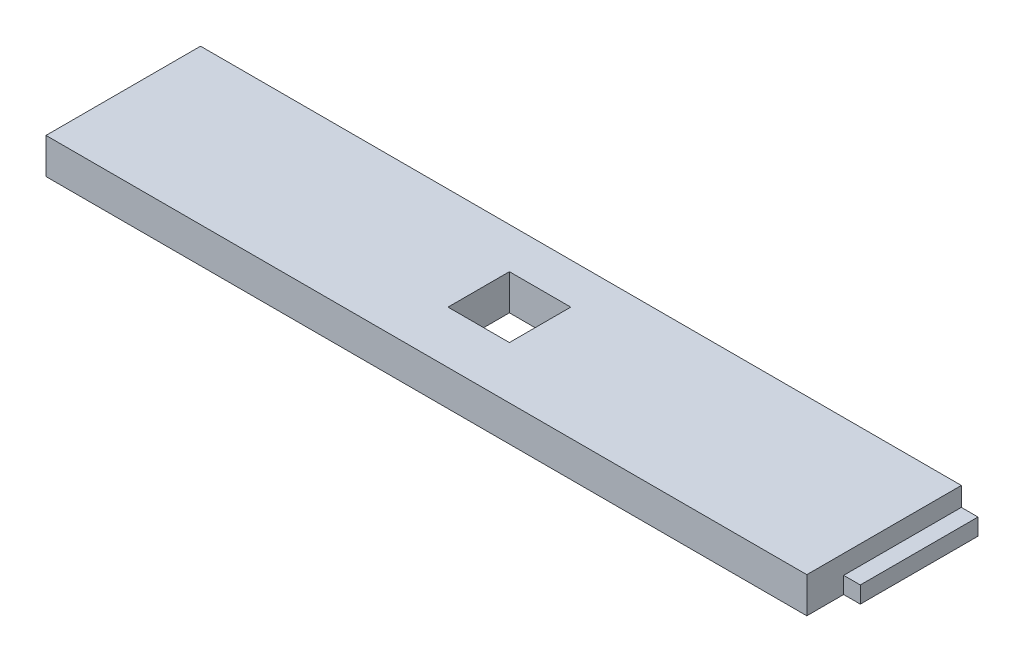
ISO-10303-21;
HEADER;
FILE_DESCRIPTION(('STEP AP214'),'2;1');
FILE_NAME('part.step','',(''),(''),'','','');
FILE_SCHEMA(('AUTOMOTIVE_DESIGN { 1 0 10303 214 1 1 1 1 }'));
ENDSEC;
DATA;
#1=APPLICATION_CONTEXT('core data for automotive mechanical design processes');
#2=APPLICATION_PROTOCOL_DEFINITION('international standard','automotive_design',2000,#1);
#3=PRODUCT_CONTEXT('',#1,'mechanical');
#4=PRODUCT('Part','Part','',(#3));
#5=PRODUCT_RELATED_PRODUCT_CATEGORY('part','',(#4));
#6=PRODUCT_DEFINITION_FORMATION('','',#4);
#7=PRODUCT_DEFINITION_CONTEXT('part definition',#1,'design');
#8=PRODUCT_DEFINITION('design','',#6,#7);
#9=PRODUCT_DEFINITION_SHAPE('','',#8);
#10=(LENGTH_UNIT() NAMED_UNIT(*) SI_UNIT(.MILLI.,.METRE.));
#11=(NAMED_UNIT(*) PLANE_ANGLE_UNIT() SI_UNIT($,.RADIAN.));
#12=(NAMED_UNIT(*) SI_UNIT($,.STERADIAN.) SOLID_ANGLE_UNIT());
#13=UNCERTAINTY_MEASURE_WITH_UNIT(LENGTH_MEASURE(1.E-05),#10,'distance_accuracy_value','');
#14=(GEOMETRIC_REPRESENTATION_CONTEXT(3) GLOBAL_UNCERTAINTY_ASSIGNED_CONTEXT((#13)) GLOBAL_UNIT_ASSIGNED_CONTEXT((#10,
#11,#12)) REPRESENTATION_CONTEXT('',''));
#15=CARTESIAN_POINT('',(0.,0.,0.));
#16=DIRECTION('',(0.,0.,1.));
#17=DIRECTION('',(1.,0.,0.));
#18=AXIS2_PLACEMENT_3D('',#15,#16,#17);
#19=CARTESIAN_POINT('',(25.815,30.,0.));
#20=DIRECTION('',(-1.,0.,0.));
#21=DIRECTION('',(0.,0.,1.));
#22=AXIS2_PLACEMENT_3D('',#19,#20,#21);
#23=PLANE('',#22);
#24=DIRECTION('',(0.,0.,-1.));
#25=VECTOR('',#24,1.);
#26=CARTESIAN_POINT('',(25.815,0.,0.));
#27=LINE('',#26,#25);
#28=CARTESIAN_POINT('',(25.815,0.,21.));
#29=VERTEX_POINT('',#28);
#30=CARTESIAN_POINT('',(25.815,0.,-30.63));
#31=VERTEX_POINT('',#30);
#32=EDGE_CURVE('E222',#29,#31,#27,.T.);
#33=ORIENTED_EDGE('',*,*,#32,.F.);
#34=DIRECTION('',(0.,-1.,0.));
#35=VECTOR('',#34,1.);
#36=CARTESIAN_POINT('',(25.815,30.,21.));
#37=LINE('',#36,#35);
#38=CARTESIAN_POINT('',(25.815,30.,21.));
#39=VERTEX_POINT('',#38);
#40=EDGE_CURVE('E11',#39,#29,#37,.T.);
#41=ORIENTED_EDGE('',*,*,#40,.F.);
#42=DIRECTION('',(0.,0.,-1.));
#43=VECTOR('',#42,1.);
#44=CARTESIAN_POINT('',(25.815,30.,0.));
#45=LINE('',#44,#43);
#46=CARTESIAN_POINT('',(25.815,30.,-30.63));
#47=VERTEX_POINT('',#46);
#48=EDGE_CURVE('E202',#39,#47,#45,.T.);
#49=ORIENTED_EDGE('',*,*,#48,.T.);
#50=DIRECTION('',(0.,-1.,0.));
#51=VECTOR('',#50,1.);
#52=CARTESIAN_POINT('',(25.815,30.,-30.63));
#53=LINE('',#52,#51);
#54=EDGE_CURVE('E233',#47,#31,#53,.T.);
#55=ORIENTED_EDGE('',*,*,#54,.T.);
#56=EDGE_LOOP('',(#33,#41,#49,#55));
#57=FACE_BOUND('',#56,.T.);
#58=ADVANCED_FACE('F35',(#57),#23,.T.);
#59=CARTESIAN_POINT('',(0.,30.,21.));
#60=DIRECTION('',(0.,0.,-1.));
#61=DIRECTION('',(-1.,0.,0.));
#62=AXIS2_PLACEMENT_3D('',#59,#60,#61);
#63=PLANE('',#62);
#64=DIRECTION('',(1.,0.,0.));
#65=VECTOR('',#64,1.);
#66=CARTESIAN_POINT('',(0.,0.,21.));
#67=LINE('',#66,#65);
#68=CARTESIAN_POINT('',(-25.815,0.,21.));
#69=VERTEX_POINT('',#68);
#70=EDGE_CURVE('E225',#69,#29,#67,.T.);
#71=ORIENTED_EDGE('',*,*,#70,.F.);
#72=DIRECTION('',(0.,-1.,0.));
#73=VECTOR('',#72,1.);
#74=CARTESIAN_POINT('',(-25.815,30.,21.));
#75=LINE('',#74,#73);
#76=CARTESIAN_POINT('',(-25.815,30.,21.));
#77=VERTEX_POINT('',#76);
#78=EDGE_CURVE('E44',#77,#69,#75,.T.);
#79=ORIENTED_EDGE('',*,*,#78,.F.);
#80=DIRECTION('',(1.,0.,0.));
#81=VECTOR('',#80,1.);
#82=CARTESIAN_POINT('',(0.,30.,21.));
#83=LINE('',#82,#81);
#84=EDGE_CURVE('E205',#77,#39,#83,.T.);
#85=ORIENTED_EDGE('',*,*,#84,.T.);
#86=ORIENTED_EDGE('',*,*,#40,.T.);
#87=EDGE_LOOP('',(#71,#79,#85,#86));
#88=FACE_BOUND('',#87,.T.);
#89=ADVANCED_FACE('F279',(#88),#63,.T.);
#90=CARTESIAN_POINT('',(-25.815,30.,0.));
#91=DIRECTION('',(-1.,0.,0.));
#92=DIRECTION('',(0.,0.,1.));
#93=AXIS2_PLACEMENT_3D('',#90,#91,#92);
#94=PLANE('',#93);
#95=DIRECTION('',(0.,0.,-1.));
#96=VECTOR('',#95,1.);
#97=CARTESIAN_POINT('',(-25.815,0.,0.));
#98=LINE('',#97,#96);
#99=CARTESIAN_POINT('',(-25.815,0.,-30.63));
#100=VERTEX_POINT('',#99);
#101=EDGE_CURVE('E228',#69,#100,#98,.T.);
#102=ORIENTED_EDGE('',*,*,#101,.T.);
#103=DIRECTION('',(0.,-1.,0.));
#104=VECTOR('',#103,1.);
#105=CARTESIAN_POINT('',(-25.815,30.,-30.63));
#106=LINE('',#105,#104);
#107=CARTESIAN_POINT('',(-25.815,30.,-30.63));
#108=VERTEX_POINT('',#107);
#109=EDGE_CURVE('E235',#108,#100,#106,.T.);
#110=ORIENTED_EDGE('',*,*,#109,.F.);
#111=DIRECTION('',(0.,0.,-1.));
#112=VECTOR('',#111,1.);
#113=CARTESIAN_POINT('',(-25.815,30.,0.));
#114=LINE('',#113,#112);
#115=EDGE_CURVE('E208',#77,#108,#114,.T.);
#116=ORIENTED_EDGE('',*,*,#115,.F.);
#117=ORIENTED_EDGE('',*,*,#78,.T.);
#118=EDGE_LOOP('',(#102,#110,#116,#117));
#119=FACE_BOUND('',#118,.T.);
#120=ADVANCED_FACE('F274',(#119),#94,.F.);
#121=CARTESIAN_POINT('',(320.,30.,0.));
#122=DIRECTION('',(1.,0.,0.));
#123=DIRECTION('',(0.,0.,-1.));
#124=AXIS2_PLACEMENT_3D('',#121,#122,#123);
#125=PLANE('',#124);
#126=DIRECTION('',(0.,-1.,0.));
#127=VECTOR('',#126,1.);
#128=CARTESIAN_POINT('',(320.,14.,34.));
#129=LINE('',#128,#127);
#130=CARTESIAN_POINT('',(320.,14.,34.));
#131=VERTEX_POINT('',#130);
#132=CARTESIAN_POINT('',(320.,0.,34.));
#133=VERTEX_POINT('',#132);
#134=EDGE_CURVE('E146',#131,#133,#129,.T.);
#135=ORIENTED_EDGE('',*,*,#134,.F.);
#136=DIRECTION('',(0.,0.,1.));
#137=VECTOR('',#136,1.);
#138=CARTESIAN_POINT('',(320.,14.,0.));
#139=LINE('',#138,#137);
#140=CARTESIAN_POINT('',(320.,14.,-65.));
#141=VERTEX_POINT('',#140);
#142=EDGE_CURVE('E52',#141,#131,#139,.T.);
#143=ORIENTED_EDGE('',*,*,#142,.F.);
#144=DIRECTION('',(0.,-1.,0.));
#145=VECTOR('',#144,1.);
#146=CARTESIAN_POINT('',(320.,30.,-65.));
#147=LINE('',#146,#145);
#148=CARTESIAN_POINT('',(320.,30.,-65.));
#149=VERTEX_POINT('',#148);
#150=EDGE_CURVE('E39',#149,#141,#147,.T.);
#151=ORIENTED_EDGE('',*,*,#150,.F.);
#152=DIRECTION('',(0.,0.,1.));
#153=VECTOR('',#152,1.);
#154=CARTESIAN_POINT('',(320.,30.,0.));
#155=LINE('',#154,#153);
#156=CARTESIAN_POINT('',(320.,30.,65.));
#157=VERTEX_POINT('',#156);
#158=EDGE_CURVE('E192',#149,#157,#155,.T.);
#159=ORIENTED_EDGE('',*,*,#158,.T.);
#160=DIRECTION('',(0.,-1.,0.));
#161=VECTOR('',#160,1.);
#162=CARTESIAN_POINT('',(320.,30.,65.));
#163=LINE('',#162,#161);
#164=CARTESIAN_POINT('',(320.,0.,65.));
#165=VERTEX_POINT('',#164);
#166=EDGE_CURVE('E213',#157,#165,#163,.T.);
#167=ORIENTED_EDGE('',*,*,#166,.T.);
#168=DIRECTION('',(0.,0.,1.));
#169=VECTOR('',#168,1.);
#170=CARTESIAN_POINT('',(320.,0.,0.));
#171=LINE('',#170,#169);
#172=EDGE_CURVE('E58',#133,#165,#171,.T.);
#173=ORIENTED_EDGE('',*,*,#172,.F.);
#174=EDGE_LOOP('',(#135,#143,#151,#159,#167,#173));
#175=FACE_BOUND('',#174,.T.);
#176=ADVANCED_FACE('F37',(#175),#125,.T.);
#177=CARTESIAN_POINT('',(0.,30.,-65.));
#178=DIRECTION('',(0.,0.,-1.));
#179=DIRECTION('',(-1.,0.,0.));
#180=AXIS2_PLACEMENT_3D('',#177,#178,#179);
#181=PLANE('',#180);
#182=DIRECTION('',(1.,0.,0.));
#183=VECTOR('',#182,1.);
#184=CARTESIAN_POINT('',(0.,0.,-65.));
#185=LINE('',#184,#183);
#186=CARTESIAN_POINT('',(-334.,0.,-65.));
#187=VERTEX_POINT('',#186);
#188=CARTESIAN_POINT('',(334.,0.,-65.));
#189=VERTEX_POINT('',#188);
#190=EDGE_CURVE('E215',#187,#189,#185,.T.);
#191=ORIENTED_EDGE('',*,*,#190,.F.);
#192=DIRECTION('',(0.,-1.,0.));
#193=VECTOR('',#192,1.);
#194=CARTESIAN_POINT('',(-334.,14.,-65.));
#195=LINE('',#194,#193);
#196=CARTESIAN_POINT('',(-334.,14.,-65.));
#197=VERTEX_POINT('',#196);
#198=EDGE_CURVE('E189',#197,#187,#195,.T.);
#199=ORIENTED_EDGE('',*,*,#198,.F.);
#200=DIRECTION('',(1.,0.,0.));
#201=VECTOR('',#200,1.);
#202=CARTESIAN_POINT('',(0.,14.,-65.));
#203=LINE('',#202,#201);
#204=CARTESIAN_POINT('',(-320.,14.,-65.));
#205=VERTEX_POINT('',#204);
#206=EDGE_CURVE('E169',#197,#205,#203,.T.);
#207=ORIENTED_EDGE('',*,*,#206,.T.);
#208=DIRECTION('',(0.,-1.,0.));
#209=VECTOR('',#208,1.);
#210=CARTESIAN_POINT('',(-320.,30.,-65.));
#211=LINE('',#210,#209);
#212=CARTESIAN_POINT('',(-320.,30.,-65.));
#213=VERTEX_POINT('',#212);
#214=EDGE_CURVE('E242',#213,#205,#211,.T.);
#215=ORIENTED_EDGE('',*,*,#214,.F.);
#216=DIRECTION('',(1.,0.,0.));
#217=VECTOR('',#216,1.);
#218=CARTESIAN_POINT('',(0.,30.,-65.));
#219=LINE('',#218,#217);
#220=EDGE_CURVE('E195',#213,#149,#219,.T.);
#221=ORIENTED_EDGE('',*,*,#220,.T.);
#222=ORIENTED_EDGE('',*,*,#150,.T.);
#223=DIRECTION('',(1.,0.,0.));
#224=VECTOR('',#223,1.);
#225=CARTESIAN_POINT('',(0.,14.,-65.));
#226=LINE('',#225,#224);
#227=CARTESIAN_POINT('',(334.,14.,-65.));
#228=VERTEX_POINT('',#227);
#229=EDGE_CURVE('E151',#141,#228,#226,.T.);
#230=ORIENTED_EDGE('',*,*,#229,.T.);
#231=DIRECTION('',(0.,-1.,0.));
#232=VECTOR('',#231,1.);
#233=CARTESIAN_POINT('',(334.,14.,-65.));
#234=LINE('',#233,#232);
#235=EDGE_CURVE('E137',#228,#189,#234,.T.);
#236=ORIENTED_EDGE('',*,*,#235,.T.);
#237=EDGE_LOOP('',(#191,#199,#207,#215,#221,#222,#230,#236));
#238=FACE_BOUND('',#237,.T.);
#239=ADVANCED_FACE('F157',(#238),#181,.T.);
#240=CARTESIAN_POINT('',(-320.,30.,0.));
#241=DIRECTION('',(1.,0.,0.));
#242=DIRECTION('',(0.,0.,-1.));
#243=AXIS2_PLACEMENT_3D('',#240,#241,#242);
#244=PLANE('',#243);
#245=ORIENTED_EDGE('',*,*,#214,.T.);
#246=DIRECTION('',(0.,0.,1.));
#247=VECTOR('',#246,1.);
#248=CARTESIAN_POINT('',(-320.,14.,0.));
#249=LINE('',#248,#247);
#250=CARTESIAN_POINT('',(-320.,14.,34.));
#251=VERTEX_POINT('',#250);
#252=EDGE_CURVE('E177',#205,#251,#249,.T.);
#253=ORIENTED_EDGE('',*,*,#252,.T.);
#254=DIRECTION('',(0.,-1.,0.));
#255=VECTOR('',#254,1.);
#256=CARTESIAN_POINT('',(-320.,14.,34.));
#257=LINE('',#256,#255);
#258=CARTESIAN_POINT('',(-320.,0.,34.));
#259=VERTEX_POINT('',#258);
#260=EDGE_CURVE('E180',#251,#259,#257,.T.);
#261=ORIENTED_EDGE('',*,*,#260,.T.);
#262=DIRECTION('',(0.,0.,1.));
#263=VECTOR('',#262,1.);
#264=CARTESIAN_POINT('',(-320.,0.,0.));
#265=LINE('',#264,#263);
#266=CARTESIAN_POINT('',(-320.,0.,65.));
#267=VERTEX_POINT('',#266);
#268=EDGE_CURVE('E217',#259,#267,#265,.T.);
#269=ORIENTED_EDGE('',*,*,#268,.T.);
#270=DIRECTION('',(0.,-1.,0.));
#271=VECTOR('',#270,1.);
#272=CARTESIAN_POINT('',(-320.,30.,65.));
#273=LINE('',#272,#271);
#274=CARTESIAN_POINT('',(-320.,30.,65.));
#275=VERTEX_POINT('',#274);
#276=EDGE_CURVE('E240',#275,#267,#273,.T.);
#277=ORIENTED_EDGE('',*,*,#276,.F.);
#278=DIRECTION('',(0.,0.,1.));
#279=VECTOR('',#278,1.);
#280=CARTESIAN_POINT('',(-320.,30.,0.));
#281=LINE('',#280,#279);
#282=EDGE_CURVE('E198',#213,#275,#281,.T.);
#283=ORIENTED_EDGE('',*,*,#282,.F.);
#284=EDGE_LOOP('',(#245,#253,#261,#269,#277,#283));
#285=FACE_BOUND('',#284,.T.);
#286=ADVANCED_FACE('F246',(#285),#244,.F.);
#287=CARTESIAN_POINT('',(0.,30.,65.));
#288=DIRECTION('',(0.,0.,-1.));
#289=DIRECTION('',(-1.,0.,0.));
#290=AXIS2_PLACEMENT_3D('',#287,#288,#289);
#291=PLANE('',#290);
#292=DIRECTION('',(1.,0.,0.));
#293=VECTOR('',#292,1.);
#294=CARTESIAN_POINT('',(0.,0.,65.));
#295=LINE('',#294,#293);
#296=EDGE_CURVE('E219',#267,#165,#295,.T.);
#297=ORIENTED_EDGE('',*,*,#296,.T.);
#298=ORIENTED_EDGE('',*,*,#166,.F.);
#299=DIRECTION('',(1.,0.,0.));
#300=VECTOR('',#299,1.);
#301=CARTESIAN_POINT('',(0.,30.,65.));
#302=LINE('',#301,#300);
#303=EDGE_CURVE('E200',#275,#157,#302,.T.);
#304=ORIENTED_EDGE('',*,*,#303,.F.);
#305=ORIENTED_EDGE('',*,*,#276,.T.);
#306=EDGE_LOOP('',(#297,#298,#304,#305));
#307=FACE_BOUND('',#306,.T.);
#308=ADVANCED_FACE('F267',(#307),#291,.F.);
#309=CARTESIAN_POINT('',(0.,30.,-30.63));
#310=DIRECTION('',(0.,0.,-1.));
#311=DIRECTION('',(-1.,0.,0.));
#312=AXIS2_PLACEMENT_3D('',#309,#310,#311);
#313=PLANE('',#312);
#314=DIRECTION('',(1.,0.,0.));
#315=VECTOR('',#314,1.);
#316=CARTESIAN_POINT('',(0.,0.,-30.63));
#317=LINE('',#316,#315);
#318=EDGE_CURVE('E196',#100,#31,#317,.T.);
#319=ORIENTED_EDGE('',*,*,#318,.T.);
#320=ORIENTED_EDGE('',*,*,#54,.F.);
#321=DIRECTION('',(1.,0.,0.));
#322=VECTOR('',#321,1.);
#323=CARTESIAN_POINT('',(0.,30.,-30.63));
#324=LINE('',#323,#322);
#325=EDGE_CURVE('E211',#108,#47,#324,.T.);
#326=ORIENTED_EDGE('',*,*,#325,.F.);
#327=ORIENTED_EDGE('',*,*,#109,.T.);
#328=EDGE_LOOP('',(#319,#320,#326,#327));
#329=FACE_BOUND('',#328,.T.);
#330=ADVANCED_FACE('F294',(#329),#313,.F.);
#331=CARTESIAN_POINT('',(0.,30.,0.));
#332=DIRECTION('',(0.,1.,0.));
#333=DIRECTION('',(0.,0.,1.));
#334=AXIS2_PLACEMENT_3D('',#331,#332,#333);
#335=PLANE('',#334);
#336=ORIENTED_EDGE('',*,*,#158,.F.);
#337=ORIENTED_EDGE('',*,*,#220,.F.);
#338=ORIENTED_EDGE('',*,*,#282,.T.);
#339=ORIENTED_EDGE('',*,*,#303,.T.);
#340=EDGE_LOOP('',(#336,#337,#338,#339));
#341=FACE_BOUND('',#340,.T.);
#342=ORIENTED_EDGE('',*,*,#48,.F.);
#343=ORIENTED_EDGE('',*,*,#84,.F.);
#344=ORIENTED_EDGE('',*,*,#115,.T.);
#345=ORIENTED_EDGE('',*,*,#325,.T.);
#346=EDGE_LOOP('',(#342,#343,#344,#345));
#347=FACE_BOUND('',#346,.T.);
#348=ADVANCED_FACE('F271',(#341,#347),#335,.T.);
#349=CARTESIAN_POINT('',(0.,0.,0.));
#350=DIRECTION('',(0.,1.,0.));
#351=DIRECTION('',(0.,0.,1.));
#352=AXIS2_PLACEMENT_3D('',#349,#350,#351);
#353=PLANE('',#352);
#354=ORIENTED_EDGE('',*,*,#190,.T.);
#355=DIRECTION('',(0.,0.,1.));
#356=VECTOR('',#355,1.);
#357=CARTESIAN_POINT('',(334.,0.,0.));
#358=LINE('',#357,#356);
#359=CARTESIAN_POINT('',(334.,0.,34.));
#360=VERTEX_POINT('',#359);
#361=EDGE_CURVE('E142',#189,#360,#358,.T.);
#362=ORIENTED_EDGE('',*,*,#361,.T.);
#363=DIRECTION('',(1.,0.,0.));
#364=VECTOR('',#363,1.);
#365=CARTESIAN_POINT('',(0.,0.,34.));
#366=LINE('',#365,#364);
#367=EDGE_CURVE('E155',#133,#360,#366,.T.);
#368=ORIENTED_EDGE('',*,*,#367,.F.);
#369=ORIENTED_EDGE('',*,*,#172,.T.);
#370=ORIENTED_EDGE('',*,*,#296,.F.);
#371=ORIENTED_EDGE('',*,*,#268,.F.);
#372=DIRECTION('',(-1.,0.,0.));
#373=VECTOR('',#372,1.);
#374=CARTESIAN_POINT('',(0.,0.,34.));
#375=LINE('',#374,#373);
#376=CARTESIAN_POINT('',(-334.,0.,34.));
#377=VERTEX_POINT('',#376);
#378=EDGE_CURVE('E172',#259,#377,#375,.T.);
#379=ORIENTED_EDGE('',*,*,#378,.T.);
#380=DIRECTION('',(0.,0.,1.));
#381=VECTOR('',#380,1.);
#382=CARTESIAN_POINT('',(-334.,0.,0.));
#383=LINE('',#382,#381);
#384=EDGE_CURVE('E145',#187,#377,#383,.T.);
#385=ORIENTED_EDGE('',*,*,#384,.F.);
#386=EDGE_LOOP('',(#354,#362,#368,#369,#370,#371,#379,#385));
#387=FACE_BOUND('',#386,.T.);
#388=ORIENTED_EDGE('',*,*,#32,.T.);
#389=ORIENTED_EDGE('',*,*,#318,.F.);
#390=ORIENTED_EDGE('',*,*,#101,.F.);
#391=ORIENTED_EDGE('',*,*,#70,.T.);
#392=EDGE_LOOP('',(#388,#389,#390,#391));
#393=FACE_BOUND('',#392,.T.);
#394=ADVANCED_FACE('F261',(#387,#393),#353,.F.);
#395=CARTESIAN_POINT('',(-334.,14.,0.));
#396=DIRECTION('',(1.,0.,0.));
#397=DIRECTION('',(0.,0.,-1.));
#398=AXIS2_PLACEMENT_3D('',#395,#396,#397);
#399=PLANE('',#398);
#400=ORIENTED_EDGE('',*,*,#384,.T.);
#401=DIRECTION('',(0.,-1.,0.));
#402=VECTOR('',#401,1.);
#403=CARTESIAN_POINT('',(-334.,14.,34.));
#404=LINE('',#403,#402);
#405=CARTESIAN_POINT('',(-334.,14.,34.));
#406=VERTEX_POINT('',#405);
#407=EDGE_CURVE('E187',#406,#377,#404,.T.);
#408=ORIENTED_EDGE('',*,*,#407,.F.);
#409=DIRECTION('',(0.,0.,1.));
#410=VECTOR('',#409,1.);
#411=CARTESIAN_POINT('',(-334.,14.,0.));
#412=LINE('',#411,#410);
#413=EDGE_CURVE('E171',#197,#406,#412,.T.);
#414=ORIENTED_EDGE('',*,*,#413,.F.);
#415=ORIENTED_EDGE('',*,*,#198,.T.);
#416=EDGE_LOOP('',(#400,#408,#414,#415));
#417=FACE_BOUND('',#416,.T.);
#418=ADVANCED_FACE('F324',(#417),#399,.F.);
#419=CARTESIAN_POINT('',(0.,14.,34.));
#420=DIRECTION('',(0.,0.,1.));
#421=DIRECTION('',(1.,0.,0.));
#422=AXIS2_PLACEMENT_3D('',#419,#420,#421);
#423=PLANE('',#422);
#424=ORIENTED_EDGE('',*,*,#378,.F.);
#425=ORIENTED_EDGE('',*,*,#260,.F.);
#426=DIRECTION('',(-1.,0.,0.));
#427=VECTOR('',#426,1.);
#428=CARTESIAN_POINT('',(0.,14.,34.));
#429=LINE('',#428,#427);
#430=EDGE_CURVE('E174',#251,#406,#429,.T.);
#431=ORIENTED_EDGE('',*,*,#430,.T.);
#432=ORIENTED_EDGE('',*,*,#407,.T.);
#433=EDGE_LOOP('',(#424,#425,#431,#432));
#434=FACE_BOUND('',#433,.T.);
#435=ADVANCED_FACE('F257',(#434),#423,.T.);
#436=CARTESIAN_POINT('',(0.,14.,0.));
#437=DIRECTION('',(0.,1.,0.));
#438=DIRECTION('',(0.,0.,1.));
#439=AXIS2_PLACEMENT_3D('',#436,#437,#438);
#440=PLANE('',#439);
#441=ORIENTED_EDGE('',*,*,#206,.F.);
#442=ORIENTED_EDGE('',*,*,#413,.T.);
#443=ORIENTED_EDGE('',*,*,#430,.F.);
#444=ORIENTED_EDGE('',*,*,#252,.F.);
#445=EDGE_LOOP('',(#441,#442,#443,#444));
#446=FACE_BOUND('',#445,.T.);
#447=ADVANCED_FACE('F254',(#446),#440,.T.);
#448=CARTESIAN_POINT('',(334.,14.,0.));
#449=DIRECTION('',(1.,0.,0.));
#450=DIRECTION('',(0.,0.,-1.));
#451=AXIS2_PLACEMENT_3D('',#448,#449,#450);
#452=PLANE('',#451);
#453=ORIENTED_EDGE('',*,*,#361,.F.);
#454=ORIENTED_EDGE('',*,*,#235,.F.);
#455=DIRECTION('',(0.,0.,1.));
#456=VECTOR('',#455,1.);
#457=CARTESIAN_POINT('',(334.,14.,0.));
#458=LINE('',#457,#456);
#459=CARTESIAN_POINT('',(334.,14.,34.));
#460=VERTEX_POINT('',#459);
#461=EDGE_CURVE('E140',#228,#460,#458,.T.);
#462=ORIENTED_EDGE('',*,*,#461,.T.);
#463=DIRECTION('',(0.,-1.,0.));
#464=VECTOR('',#463,1.);
#465=CARTESIAN_POINT('',(334.,14.,34.));
#466=LINE('',#465,#464);
#467=EDGE_CURVE('E163',#460,#360,#466,.T.);
#468=ORIENTED_EDGE('',*,*,#467,.T.);
#469=EDGE_LOOP('',(#453,#454,#462,#468));
#470=FACE_BOUND('',#469,.T.);
#471=ADVANCED_FACE('F139',(#470),#452,.T.);
#472=CARTESIAN_POINT('',(0.,14.,34.));
#473=DIRECTION('',(0.,0.,-1.));
#474=DIRECTION('',(-1.,0.,0.));
#475=AXIS2_PLACEMENT_3D('',#472,#473,#474);
#476=PLANE('',#475);
#477=ORIENTED_EDGE('',*,*,#367,.T.);
#478=ORIENTED_EDGE('',*,*,#467,.F.);
#479=DIRECTION('',(1.,0.,0.));
#480=VECTOR('',#479,1.);
#481=CARTESIAN_POINT('',(0.,14.,34.));
#482=LINE('',#481,#480);
#483=EDGE_CURVE('E153',#131,#460,#482,.T.);
#484=ORIENTED_EDGE('',*,*,#483,.F.);
#485=ORIENTED_EDGE('',*,*,#134,.T.);
#486=EDGE_LOOP('',(#477,#478,#484,#485));
#487=FACE_BOUND('',#486,.T.);
#488=ADVANCED_FACE('F350',(#487),#476,.F.);
#489=CARTESIAN_POINT('',(0.,14.,0.));
#490=DIRECTION('',(0.,1.,0.));
#491=DIRECTION('',(0.,0.,1.));
#492=AXIS2_PLACEMENT_3D('',#489,#490,#491);
#493=PLANE('',#492);
#494=ORIENTED_EDGE('',*,*,#461,.F.);
#495=ORIENTED_EDGE('',*,*,#229,.F.);
#496=ORIENTED_EDGE('',*,*,#142,.T.);
#497=ORIENTED_EDGE('',*,*,#483,.T.);
#498=EDGE_LOOP('',(#494,#495,#496,#497));
#499=FACE_BOUND('',#498,.T.);
#500=ADVANCED_FACE('F150',(#499),#493,.T.);
#501=CLOSED_SHELL('',(#58,#89,#120,#176,#239,#286,#308,#330,#348,#394,#418,#435,#447,#471,#488,#500));
#502=MANIFOLD_SOLID_BREP('B2',#501);
#503=ADVANCED_BREP_SHAPE_REPRESENTATION('',(#18,#502),#14);
#504=SHAPE_DEFINITION_REPRESENTATION(#9,#503);
ENDSEC;
END-ISO-10303-21;
